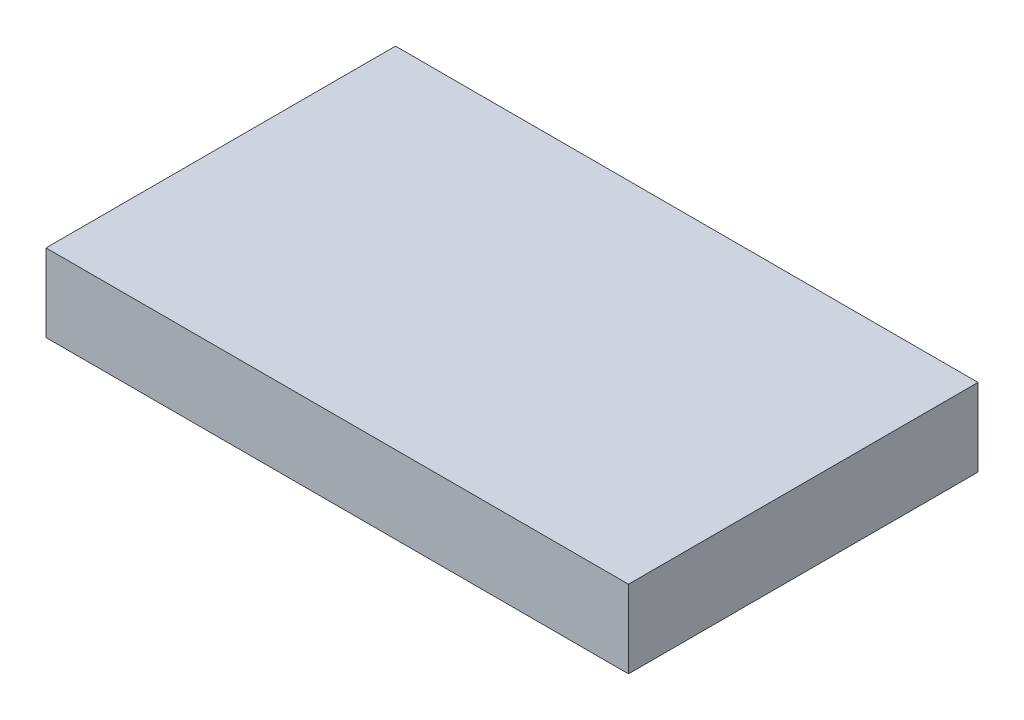
ISO-10303-21;
HEADER;
FILE_DESCRIPTION(('STEP AP214'),'2;1');
FILE_NAME('part.step','',(''),(''),'','','');
FILE_SCHEMA(('AUTOMOTIVE_DESIGN { 1 0 10303 214 1 1 1 1 }'));
ENDSEC;
DATA;
#1=APPLICATION_CONTEXT('core data for automotive mechanical design processes');
#2=APPLICATION_PROTOCOL_DEFINITION('international standard','automotive_design',2000,#1);
#3=PRODUCT_CONTEXT('',#1,'mechanical');
#4=PRODUCT('Part','Part','',(#3));
#5=PRODUCT_RELATED_PRODUCT_CATEGORY('part','',(#4));
#6=PRODUCT_DEFINITION_FORMATION('','',#4);
#7=PRODUCT_DEFINITION_CONTEXT('part definition',#1,'design');
#8=PRODUCT_DEFINITION('design','',#6,#7);
#9=PRODUCT_DEFINITION_SHAPE('','',#8);
#10=(LENGTH_UNIT() NAMED_UNIT(*) SI_UNIT(.MILLI.,.METRE.));
#11=(NAMED_UNIT(*) PLANE_ANGLE_UNIT() SI_UNIT($,.RADIAN.));
#12=(NAMED_UNIT(*) SI_UNIT($,.STERADIAN.) SOLID_ANGLE_UNIT());
#13=UNCERTAINTY_MEASURE_WITH_UNIT(LENGTH_MEASURE(1.E-05),#10,'distance_accuracy_value','');
#14=(GEOMETRIC_REPRESENTATION_CONTEXT(3) GLOBAL_UNCERTAINTY_ASSIGNED_CONTEXT((#13)) GLOBAL_UNIT_ASSIGNED_CONTEXT((#10,
#11,#12)) REPRESENTATION_CONTEXT('',''));
#15=CARTESIAN_POINT('',(0.,0.,0.));
#16=DIRECTION('',(0.,0.,1.));
#17=DIRECTION('',(1.,0.,0.));
#18=AXIS2_PLACEMENT_3D('',#15,#16,#17);
#19=CARTESIAN_POINT('',(67.9452644336584,15.0825011587739,90.));
#20=DIRECTION('',(0.,-1.,0.));
#21=DIRECTION('',(1.,0.,0.));
#22=AXIS2_PLACEMENT_3D('',#19,#20,#21);
#23=PLANE('',#22);
#24=DIRECTION('',(-1.,0.,0.));
#25=VECTOR('',#24,1.);
#26=CARTESIAN_POINT('',(67.9452644336584,15.0825011587739,0.));
#27=LINE('',#26,#25);
#28=CARTESIAN_POINT('',(67.9452644336584,15.0825011587739,0.));
#29=VERTEX_POINT('',#28);
#30=CARTESIAN_POINT('',(-82.0547355663416,15.0825011587739,0.));
#31=VERTEX_POINT('',#30);
#32=EDGE_CURVE('E96',#29,#31,#27,.T.);
#33=ORIENTED_EDGE('',*,*,#32,.T.);
#34=DIRECTION('',(0.,0.,-1.));
#35=VECTOR('',#34,1.);
#36=CARTESIAN_POINT('',(-82.0547355663416,15.0825011587739,90.));
#37=LINE('',#36,#35);
#38=CARTESIAN_POINT('',(-82.0547355663416,15.0825011587739,90.));
#39=VERTEX_POINT('',#38);
#40=EDGE_CURVE('E11',#39,#31,#37,.T.);
#41=ORIENTED_EDGE('',*,*,#40,.F.);
#42=DIRECTION('',(-1.,0.,0.));
#43=VECTOR('',#42,1.);
#44=CARTESIAN_POINT('',(67.9452644336584,15.0825011587739,90.));
#45=LINE('',#44,#43);
#46=CARTESIAN_POINT('',(67.9452644336584,15.0825011587739,90.));
#47=VERTEX_POINT('',#46);
#48=EDGE_CURVE('E84',#47,#39,#45,.T.);
#49=ORIENTED_EDGE('',*,*,#48,.F.);
#50=DIRECTION('',(0.,0.,-1.));
#51=VECTOR('',#50,1.);
#52=CARTESIAN_POINT('',(67.9452644336584,15.0825011587739,90.));
#53=LINE('',#52,#51);
#54=EDGE_CURVE('E92',#47,#29,#53,.T.);
#55=ORIENTED_EDGE('',*,*,#54,.T.);
#56=EDGE_LOOP('',(#33,#41,#49,#55));
#57=FACE_BOUND('',#56,.T.);
#58=ADVANCED_FACE('F33',(#57),#23,.F.);
#59=CARTESIAN_POINT('',(-82.0547355663416,15.0825011587739,90.));
#60=DIRECTION('',(1.,0.,0.));
#61=DIRECTION('',(0.,0.,-1.));
#62=AXIS2_PLACEMENT_3D('',#59,#60,#61);
#63=PLANE('',#62);
#64=DIRECTION('',(0.,-1.,0.));
#65=VECTOR('',#64,1.);
#66=CARTESIAN_POINT('',(-82.0547355663416,15.0825011587739,0.));
#67=LINE('',#66,#65);
#68=CARTESIAN_POINT('',(-82.0547355663416,-4.91749884122612,0.));
#69=VERTEX_POINT('',#68);
#70=EDGE_CURVE('E88',#31,#69,#67,.T.);
#71=ORIENTED_EDGE('',*,*,#70,.T.);
#72=DIRECTION('',(0.,0.,-1.));
#73=VECTOR('',#72,1.);
#74=CARTESIAN_POINT('',(-82.0547355663416,-4.91749884122612,90.));
#75=LINE('',#74,#73);
#76=CARTESIAN_POINT('',(-82.0547355663416,-4.91749884122612,90.));
#77=VERTEX_POINT('',#76);
#78=EDGE_CURVE('E41',#77,#69,#75,.T.);
#79=ORIENTED_EDGE('',*,*,#78,.F.);
#80=DIRECTION('',(0.,-1.,0.));
#81=VECTOR('',#80,1.);
#82=CARTESIAN_POINT('',(-82.0547355663416,15.0825011587739,90.));
#83=LINE('',#82,#81);
#84=EDGE_CURVE('E79',#39,#77,#83,.T.);
#85=ORIENTED_EDGE('',*,*,#84,.F.);
#86=ORIENTED_EDGE('',*,*,#40,.T.);
#87=EDGE_LOOP('',(#71,#79,#85,#86));
#88=FACE_BOUND('',#87,.T.);
#89=ADVANCED_FACE('F87',(#88),#63,.F.);
#90=CARTESIAN_POINT('',(-82.0547355663416,-4.91749884122612,90.));
#91=DIRECTION('',(0.,1.,0.));
#92=DIRECTION('',(0.,0.,1.));
#93=AXIS2_PLACEMENT_3D('',#90,#91,#92);
#94=PLANE('',#93);
#95=DIRECTION('',(1.,0.,0.));
#96=VECTOR('',#95,1.);
#97=CARTESIAN_POINT('',(-82.0547355663416,-4.91749884122612,0.));
#98=LINE('',#97,#96);
#99=CARTESIAN_POINT('',(67.9452644336584,-4.91749884122612,0.));
#100=VERTEX_POINT('',#99);
#101=EDGE_CURVE('E66',#69,#100,#98,.T.);
#102=ORIENTED_EDGE('',*,*,#101,.T.);
#103=DIRECTION('',(0.,0.,-1.));
#104=VECTOR('',#103,1.);
#105=CARTESIAN_POINT('',(67.9452644336584,-4.91749884122612,90.));
#106=LINE('',#105,#104);
#107=CARTESIAN_POINT('',(67.9452644336584,-4.91749884122612,90.));
#108=VERTEX_POINT('',#107);
#109=EDGE_CURVE('E89',#108,#100,#106,.T.);
#110=ORIENTED_EDGE('',*,*,#109,.F.);
#111=DIRECTION('',(1.,0.,0.));
#112=VECTOR('',#111,1.);
#113=CARTESIAN_POINT('',(-82.0547355663416,-4.91749884122612,90.));
#114=LINE('',#113,#112);
#115=EDGE_CURVE('E82',#77,#108,#114,.T.);
#116=ORIENTED_EDGE('',*,*,#115,.F.);
#117=ORIENTED_EDGE('',*,*,#78,.T.);
#118=EDGE_LOOP('',(#102,#110,#116,#117));
#119=FACE_BOUND('',#118,.T.);
#120=ADVANCED_FACE('F90',(#119),#94,.F.);
#121=CARTESIAN_POINT('',(67.9452644336584,-4.91749884122612,90.));
#122=DIRECTION('',(-1.,0.,0.));
#123=DIRECTION('',(0.,0.,1.));
#124=AXIS2_PLACEMENT_3D('',#121,#122,#123);
#125=PLANE('',#124);
#126=DIRECTION('',(0.,1.,0.));
#127=VECTOR('',#126,1.);
#128=CARTESIAN_POINT('',(67.9452644336584,-4.91749884122612,0.));
#129=LINE('',#128,#127);
#130=EDGE_CURVE('E72',#100,#29,#129,.T.);
#131=ORIENTED_EDGE('',*,*,#130,.T.);
#132=ORIENTED_EDGE('',*,*,#54,.F.);
#133=DIRECTION('',(0.,1.,0.));
#134=VECTOR('',#133,1.);
#135=CARTESIAN_POINT('',(67.9452644336584,-4.91749884122612,90.));
#136=LINE('',#135,#134);
#137=EDGE_CURVE('E49',#108,#47,#136,.T.);
#138=ORIENTED_EDGE('',*,*,#137,.F.);
#139=ORIENTED_EDGE('',*,*,#109,.T.);
#140=EDGE_LOOP('',(#131,#132,#138,#139));
#141=FACE_BOUND('',#140,.T.);
#142=ADVANCED_FACE('F103',(#141),#125,.F.);
#143=CARTESIAN_POINT('',(0.,0.,90.));
#144=DIRECTION('',(0.,0.,1.));
#145=DIRECTION('',(1.,0.,0.));
#146=AXIS2_PLACEMENT_3D('',#143,#144,#145);
#147=PLANE('',#146);
#148=ORIENTED_EDGE('',*,*,#48,.T.);
#149=ORIENTED_EDGE('',*,*,#84,.T.);
#150=ORIENTED_EDGE('',*,*,#115,.T.);
#151=ORIENTED_EDGE('',*,*,#137,.T.);
#152=EDGE_LOOP('',(#148,#149,#150,#151));
#153=FACE_BOUND('',#152,.T.);
#154=ADVANCED_FACE('F80',(#153),#147,.T.);
#155=CARTESIAN_POINT('',(0.,0.,0.));
#156=DIRECTION('',(0.,0.,1.));
#157=DIRECTION('',(1.,0.,0.));
#158=AXIS2_PLACEMENT_3D('',#155,#156,#157);
#159=PLANE('',#158);
#160=ORIENTED_EDGE('',*,*,#32,.F.);
#161=ORIENTED_EDGE('',*,*,#130,.F.);
#162=ORIENTED_EDGE('',*,*,#101,.F.);
#163=ORIENTED_EDGE('',*,*,#70,.F.);
#164=EDGE_LOOP('',(#160,#161,#162,#163));
#165=FACE_BOUND('',#164,.T.);
#166=ADVANCED_FACE('F106',(#165),#159,.F.);
#167=CLOSED_SHELL('',(#58,#89,#120,#142,#154,#166));
#168=MANIFOLD_SOLID_BREP('B2',#167);
#169=ADVANCED_BREP_SHAPE_REPRESENTATION('',(#18,#168),#14);
#170=SHAPE_DEFINITION_REPRESENTATION(#9,#169);
ENDSEC;
END-ISO-10303-21;
